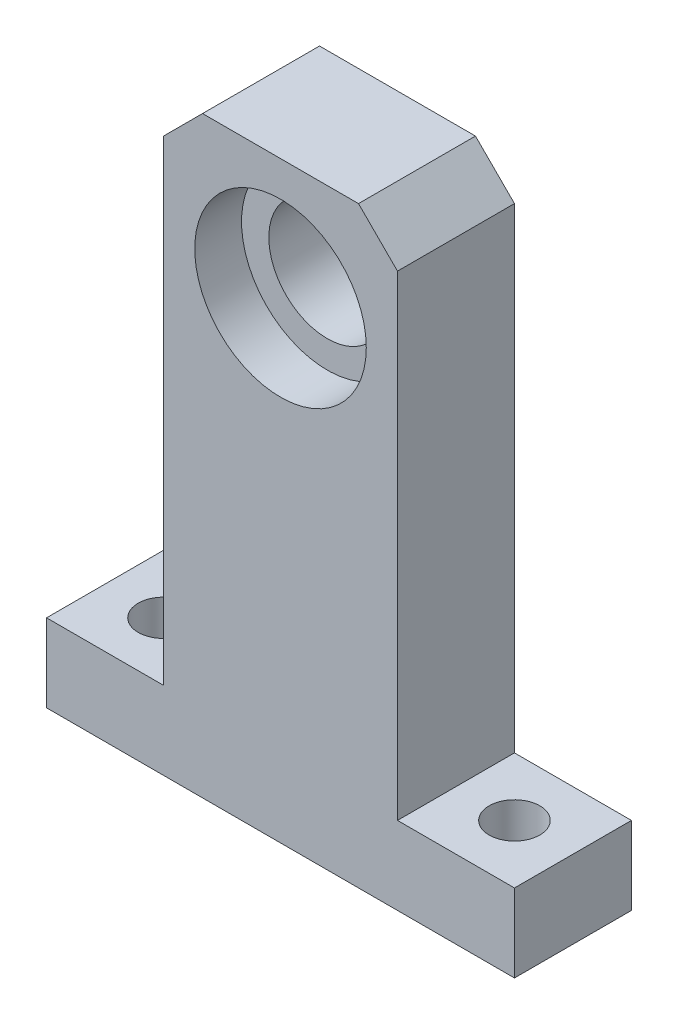
ISO-10303-21;
HEADER;
FILE_DESCRIPTION(('STEP AP214'),'2;1');
FILE_NAME('part.step','',(''),(''),'','','');
FILE_SCHEMA(('AUTOMOTIVE_DESIGN { 1 0 10303 214 1 1 1 1 }'));
ENDSEC;
DATA;
#1=APPLICATION_CONTEXT('core data for automotive mechanical design processes');
#2=APPLICATION_PROTOCOL_DEFINITION('international standard','automotive_design',2000,#1);
#3=PRODUCT_CONTEXT('',#1,'mechanical');
#4=PRODUCT('Part','Part','',(#3));
#5=PRODUCT_RELATED_PRODUCT_CATEGORY('part','',(#4));
#6=PRODUCT_DEFINITION_FORMATION('','',#4);
#7=PRODUCT_DEFINITION_CONTEXT('part definition',#1,'design');
#8=PRODUCT_DEFINITION('design','',#6,#7);
#9=PRODUCT_DEFINITION_SHAPE('','',#8);
#10=(LENGTH_UNIT() NAMED_UNIT(*) SI_UNIT(.MILLI.,.METRE.));
#11=(NAMED_UNIT(*) PLANE_ANGLE_UNIT() SI_UNIT($,.RADIAN.));
#12=(NAMED_UNIT(*) SI_UNIT($,.STERADIAN.) SOLID_ANGLE_UNIT());
#13=UNCERTAINTY_MEASURE_WITH_UNIT(LENGTH_MEASURE(1.E-05),#10,'distance_accuracy_value','');
#14=(GEOMETRIC_REPRESENTATION_CONTEXT(3) GLOBAL_UNCERTAINTY_ASSIGNED_CONTEXT((#13)) GLOBAL_UNIT_ASSIGNED_CONTEXT((#10,
#11,#12)) REPRESENTATION_CONTEXT('',''));
#15=CARTESIAN_POINT('',(0.,0.,0.));
#16=DIRECTION('',(0.,0.,1.));
#17=DIRECTION('',(1.,0.,0.));
#18=AXIS2_PLACEMENT_3D('',#15,#16,#17);
#19=CARTESIAN_POINT('',(0.,22.5,-7.5));
#20=DIRECTION('',(0.,0.,1.));
#21=DIRECTION('',(1.,0.,0.));
#22=AXIS2_PLACEMENT_3D('',#19,#20,#21);
#23=CYLINDRICAL_SURFACE('',#22,7.5);
#24=CARTESIAN_POINT('',(0.,22.5,-7.5));
#25=DIRECTION('',(0.,0.,1.));
#26=DIRECTION('',(1.,0.,0.));
#27=AXIS2_PLACEMENT_3D('',#24,#25,#26);
#28=CIRCLE('',#27,7.5);
#29=CARTESIAN_POINT('',(7.5,22.5,-7.5));
#30=VERTEX_POINT('',#29);
#31=EDGE_CURVE('E420',#30,#30,#28,.T.);
#32=ORIENTED_EDGE('',*,*,#31,.F.);
#33=EDGE_LOOP('',(#32));
#34=FACE_BOUND('',#33,.T.);
#35=CARTESIAN_POINT('',(0.,22.5,1.5));
#36=DIRECTION('',(0.,0.,1.));
#37=DIRECTION('',(1.,0.,0.));
#38=AXIS2_PLACEMENT_3D('',#35,#36,#37);
#39=CIRCLE('',#38,7.5);
#40=CARTESIAN_POINT('',(7.5,22.5,1.5));
#41=VERTEX_POINT('',#40);
#42=EDGE_CURVE('E38',#41,#41,#39,.F.);
#43=ORIENTED_EDGE('',*,*,#42,.F.);
#44=EDGE_LOOP('',(#43));
#45=FACE_BOUND('',#44,.T.);
#46=ADVANCED_FACE('F34',(#34,#45),#23,.F.);
#47=CARTESIAN_POINT('',(30.,38.,7.5));
#48=DIRECTION('',(-1.,0.,0.));
#49=DIRECTION('',(0.,-1.,0.));
#50=AXIS2_PLACEMENT_3D('',#47,#48,#49);
#51=PLANE('',#50);
#52=DIRECTION('',(0.,1.,0.));
#53=VECTOR('',#52,1.);
#54=CARTESIAN_POINT('',(30.,38.,-7.5));
#55=LINE('',#54,#53);
#56=CARTESIAN_POINT('',(30.,-38.,-7.5));
#57=VERTEX_POINT('',#56);
#58=CARTESIAN_POINT('',(30.,-28.,-7.5));
#59=VERTEX_POINT('',#58);
#60=EDGE_CURVE('E131',#57,#59,#55,.T.);
#61=ORIENTED_EDGE('',*,*,#60,.T.);
#62=DIRECTION('',(0.,0.,1.));
#63=VECTOR('',#62,1.);
#64=CARTESIAN_POINT('',(30.,-28.,-7.5));
#65=LINE('',#64,#63);
#66=CARTESIAN_POINT('',(30.,-28.,7.5));
#67=VERTEX_POINT('',#66);
#68=EDGE_CURVE('E113',#59,#67,#65,.T.);
#69=ORIENTED_EDGE('',*,*,#68,.T.);
#70=DIRECTION('',(0.,1.,0.));
#71=VECTOR('',#70,1.);
#72=CARTESIAN_POINT('',(30.,38.,7.5));
#73=LINE('',#72,#71);
#74=CARTESIAN_POINT('',(30.,-38.,7.5));
#75=VERTEX_POINT('',#74);
#76=EDGE_CURVE('E153',#75,#67,#73,.T.);
#77=ORIENTED_EDGE('',*,*,#76,.F.);
#78=DIRECTION('',(0.,0.,-1.));
#79=VECTOR('',#78,1.);
#80=CARTESIAN_POINT('',(30.,-38.,7.5));
#81=LINE('',#80,#79);
#82=EDGE_CURVE('E138',#75,#57,#81,.T.);
#83=ORIENTED_EDGE('',*,*,#82,.T.);
#84=EDGE_LOOP('',(#61,#69,#77,#83));
#85=FACE_BOUND('',#84,.T.);
#86=ADVANCED_FACE('F136',(#85),#51,.F.);
#87=CARTESIAN_POINT('',(-30.,38.,7.5));
#88=DIRECTION('',(0.,-1.,0.));
#89=DIRECTION('',(0.,0.,-1.));
#90=AXIS2_PLACEMENT_3D('',#87,#88,#89);
#91=PLANE('',#90);
#92=DIRECTION('',(-1.,0.,0.));
#93=VECTOR('',#92,1.);
#94=CARTESIAN_POINT('',(-30.,38.,7.5));
#95=LINE('',#94,#93);
#96=CARTESIAN_POINT('',(9.99999999999996,38.,7.5));
#97=VERTEX_POINT('',#96);
#98=CARTESIAN_POINT('',(-10.,38.,7.5));
#99=VERTEX_POINT('',#98);
#100=EDGE_CURVE('E202',#97,#99,#95,.T.);
#101=ORIENTED_EDGE('',*,*,#100,.F.);
#102=DIRECTION('',(0.,0.,-1.));
#103=VECTOR('',#102,1.);
#104=CARTESIAN_POINT('',(9.99999999999996,38.,7.5));
#105=LINE('',#104,#103);
#106=CARTESIAN_POINT('',(9.99999999999997,38.,-7.5));
#107=VERTEX_POINT('',#106);
#108=EDGE_CURVE('E168',#97,#107,#105,.T.);
#109=ORIENTED_EDGE('',*,*,#108,.T.);
#110=DIRECTION('',(-1.,0.,0.));
#111=VECTOR('',#110,1.);
#112=CARTESIAN_POINT('',(-30.,38.,-7.5));
#113=LINE('',#112,#111);
#114=CARTESIAN_POINT('',(-10.,38.,-7.5));
#115=VERTEX_POINT('',#114);
#116=EDGE_CURVE('E139',#107,#115,#113,.T.);
#117=ORIENTED_EDGE('',*,*,#116,.T.);
#118=DIRECTION('',(0.,0.,1.));
#119=VECTOR('',#118,1.);
#120=CARTESIAN_POINT('',(-10.,38.,7.5));
#121=LINE('',#120,#119);
#122=EDGE_CURVE('E165',#115,#99,#121,.T.);
#123=ORIENTED_EDGE('',*,*,#122,.T.);
#124=EDGE_LOOP('',(#101,#109,#117,#123));
#125=FACE_BOUND('',#124,.T.);
#126=ADVANCED_FACE('F227',(#125),#91,.F.);
#127=CARTESIAN_POINT('',(-30.,38.,7.5));
#128=DIRECTION('',(1.,0.,0.));
#129=DIRECTION('',(0.,1.,0.));
#130=AXIS2_PLACEMENT_3D('',#127,#128,#129);
#131=PLANE('',#130);
#132=DIRECTION('',(0.,-1.,0.));
#133=VECTOR('',#132,1.);
#134=CARTESIAN_POINT('',(-30.,38.,7.5));
#135=LINE('',#134,#133);
#136=CARTESIAN_POINT('',(-30.,-28.,7.5));
#137=VERTEX_POINT('',#136);
#138=CARTESIAN_POINT('',(-30.,-38.,7.5));
#139=VERTEX_POINT('',#138);
#140=EDGE_CURVE('E204',#137,#139,#135,.T.);
#141=ORIENTED_EDGE('',*,*,#140,.F.);
#142=DIRECTION('',(0.,0.,1.));
#143=VECTOR('',#142,1.);
#144=CARTESIAN_POINT('',(-30.,-28.,-7.5));
#145=LINE('',#144,#143);
#146=CARTESIAN_POINT('',(-30.,-28.,-7.5));
#147=VERTEX_POINT('',#146);
#148=EDGE_CURVE('E144',#147,#137,#145,.T.);
#149=ORIENTED_EDGE('',*,*,#148,.F.);
#150=DIRECTION('',(0.,-1.,0.));
#151=VECTOR('',#150,1.);
#152=CARTESIAN_POINT('',(-30.,38.,-7.5));
#153=LINE('',#152,#151);
#154=CARTESIAN_POINT('',(-30.,-38.,-7.5));
#155=VERTEX_POINT('',#154);
#156=EDGE_CURVE('E142',#147,#155,#153,.T.);
#157=ORIENTED_EDGE('',*,*,#156,.T.);
#158=DIRECTION('',(0.,0.,-1.));
#159=VECTOR('',#158,1.);
#160=CARTESIAN_POINT('',(-30.,-38.,7.5));
#161=LINE('',#160,#159);
#162=EDGE_CURVE('E155',#139,#155,#161,.T.);
#163=ORIENTED_EDGE('',*,*,#162,.F.);
#164=EDGE_LOOP('',(#141,#149,#157,#163));
#165=FACE_BOUND('',#164,.T.);
#166=ADVANCED_FACE('F217',(#165),#131,.F.);
#167=CARTESIAN_POINT('',(-30.,-38.,7.5));
#168=DIRECTION('',(0.,1.,0.));
#169=DIRECTION('',(0.,0.,1.));
#170=AXIS2_PLACEMENT_3D('',#167,#168,#169);
#171=PLANE('',#170);
#172=CARTESIAN_POINT('',(-22.5,-38.,0.));
#173=DIRECTION('',(0.,-1.,0.));
#174=DIRECTION('',(0.,0.,-1.));
#175=AXIS2_PLACEMENT_3D('',#172,#173,#174);
#176=CIRCLE('',#175,3.25);
#177=CARTESIAN_POINT('',(-22.5,-38.,-3.25));
#178=VERTEX_POINT('',#177);
#179=EDGE_CURVE('E184',#178,#178,#176,.T.);
#180=ORIENTED_EDGE('',*,*,#179,.F.);
#181=EDGE_LOOP('',(#180));
#182=FACE_BOUND('',#181,.T.);
#183=CARTESIAN_POINT('',(22.5,-38.,0.));
#184=DIRECTION('',(0.,-1.,0.));
#185=DIRECTION('',(0.,0.,-1.));
#186=AXIS2_PLACEMENT_3D('',#183,#184,#185);
#187=CIRCLE('',#186,3.25);
#188=CARTESIAN_POINT('',(22.5,-38.,-3.25));
#189=VERTEX_POINT('',#188);
#190=EDGE_CURVE('E174',#189,#189,#187,.T.);
#191=ORIENTED_EDGE('',*,*,#190,.F.);
#192=EDGE_LOOP('',(#191));
#193=FACE_BOUND('',#192,.T.);
#194=DIRECTION('',(1.,0.,0.));
#195=VECTOR('',#194,1.);
#196=CARTESIAN_POINT('',(-30.,-38.,-7.5));
#197=LINE('',#196,#195);
#198=EDGE_CURVE('E151',#155,#57,#197,.T.);
#199=ORIENTED_EDGE('',*,*,#198,.T.);
#200=ORIENTED_EDGE('',*,*,#82,.F.);
#201=DIRECTION('',(1.,0.,0.));
#202=VECTOR('',#201,1.);
#203=CARTESIAN_POINT('',(-30.,-38.,7.5));
#204=LINE('',#203,#202);
#205=EDGE_CURVE('E147',#139,#75,#204,.T.);
#206=ORIENTED_EDGE('',*,*,#205,.F.);
#207=ORIENTED_EDGE('',*,*,#162,.T.);
#208=EDGE_LOOP('',(#199,#200,#206,#207));
#209=FACE_BOUND('',#208,.T.);
#210=ADVANCED_FACE('F213',(#182,#193,#209),#171,.F.);
#211=CARTESIAN_POINT('',(30.,-38.,7.5));
#212=DIRECTION('',(0.,0.,1.));
#213=DIRECTION('',(1.,0.,0.));
#214=AXIS2_PLACEMENT_3D('',#211,#212,#213);
#215=PLANE('',#214);
#216=CARTESIAN_POINT('',(0.,22.5,7.5));
#217=DIRECTION('',(0.,0.,1.));
#218=DIRECTION('',(1.,0.,0.));
#219=AXIS2_PLACEMENT_3D('',#216,#217,#218);
#220=CIRCLE('',#219,11.);
#221=CARTESIAN_POINT('',(11.,22.5,7.5));
#222=VERTEX_POINT('',#221);
#223=EDGE_CURVE('E416',#222,#222,#220,.T.);
#224=ORIENTED_EDGE('',*,*,#223,.F.);
#225=EDGE_LOOP('',(#224));
#226=FACE_BOUND('',#225,.T.);
#227=DIRECTION('',(0.,-1.,0.));
#228=VECTOR('',#227,1.);
#229=CARTESIAN_POINT('',(15.,38.,7.5));
#230=LINE('',#229,#228);
#231=CARTESIAN_POINT('',(15.,33.,7.5));
#232=VERTEX_POINT('',#231);
#233=CARTESIAN_POINT('',(15.,-28.,7.5));
#234=VERTEX_POINT('',#233);
#235=EDGE_CURVE('E173',#232,#234,#230,.T.);
#236=ORIENTED_EDGE('',*,*,#235,.F.);
#237=DIRECTION('',(0.707106781186549,-0.707106781186546,0.));
#238=VECTOR('',#237,1.);
#239=CARTESIAN_POINT('',(58.,-9.99999999999982,7.5));
#240=LINE('',#239,#238);
#241=EDGE_CURVE('E163',#232,#97,#240,.F.);
#242=ORIENTED_EDGE('',*,*,#241,.T.);
#243=ORIENTED_EDGE('',*,*,#100,.T.);
#244=DIRECTION('',(0.707106781186546,0.707106781186549,0.));
#245=VECTOR('',#244,1.);
#246=CARTESIAN_POINT('',(-28.0000000000001,19.9999999999998,7.5));
#247=LINE('',#246,#245);
#248=CARTESIAN_POINT('',(-15.,33.,7.5));
#249=VERTEX_POINT('',#248);
#250=EDGE_CURVE('E161',#99,#249,#247,.F.);
#251=ORIENTED_EDGE('',*,*,#250,.T.);
#252=DIRECTION('',(0.,1.,0.));
#253=VECTOR('',#252,1.);
#254=CARTESIAN_POINT('',(-15.,38.,7.5));
#255=LINE('',#254,#253);
#256=CARTESIAN_POINT('',(-15.,-28.,7.5));
#257=VERTEX_POINT('',#256);
#258=EDGE_CURVE('E195',#257,#249,#255,.T.);
#259=ORIENTED_EDGE('',*,*,#258,.F.);
#260=DIRECTION('',(1.,0.,0.));
#261=VECTOR('',#260,1.);
#262=CARTESIAN_POINT('',(-30.,-28.,7.5));
#263=LINE('',#262,#261);
#264=EDGE_CURVE('E125',#137,#257,#263,.T.);
#265=ORIENTED_EDGE('',*,*,#264,.F.);
#266=ORIENTED_EDGE('',*,*,#140,.T.);
#267=ORIENTED_EDGE('',*,*,#205,.T.);
#268=ORIENTED_EDGE('',*,*,#76,.T.);
#269=DIRECTION('',(1.,0.,0.));
#270=VECTOR('',#269,1.);
#271=CARTESIAN_POINT('',(30.,-28.,7.5));
#272=LINE('',#271,#270);
#273=EDGE_CURVE('E120',#234,#67,#272,.T.);
#274=ORIENTED_EDGE('',*,*,#273,.F.);
#275=EDGE_LOOP('',(#236,#242,#243,#251,#259,#265,#266,#267,#268,#274));
#276=FACE_BOUND('',#275,.T.);
#277=ADVANCED_FACE('F211',(#226,#276),#215,.T.);
#278=CARTESIAN_POINT('',(30.,-38.,-7.5));
#279=DIRECTION('',(0.,0.,1.));
#280=DIRECTION('',(1.,0.,0.));
#281=AXIS2_PLACEMENT_3D('',#278,#279,#280);
#282=PLANE('',#281);
#283=ORIENTED_EDGE('',*,*,#31,.T.);
#284=EDGE_LOOP('',(#283));
#285=FACE_BOUND('',#284,.T.);
#286=ORIENTED_EDGE('',*,*,#116,.F.);
#287=DIRECTION('',(-0.707106781186549,0.707106781186546,0.));
#288=VECTOR('',#287,1.);
#289=CARTESIAN_POINT('',(15.,33.,-7.5));
#290=LINE('',#289,#288);
#291=CARTESIAN_POINT('',(15.,33.,-7.5));
#292=VERTEX_POINT('',#291);
#293=EDGE_CURVE('E43',#107,#292,#290,.F.);
#294=ORIENTED_EDGE('',*,*,#293,.T.);
#295=DIRECTION('',(0.,-1.,0.));
#296=VECTOR('',#295,1.);
#297=CARTESIAN_POINT('',(15.,38.,-7.5));
#298=LINE('',#297,#296);
#299=CARTESIAN_POINT('',(15.,-28.,-7.5));
#300=VERTEX_POINT('',#299);
#301=EDGE_CURVE('E133',#292,#300,#298,.T.);
#302=ORIENTED_EDGE('',*,*,#301,.T.);
#303=DIRECTION('',(1.,0.,0.));
#304=VECTOR('',#303,1.);
#305=CARTESIAN_POINT('',(30.,-28.,-7.5));
#306=LINE('',#305,#304);
#307=EDGE_CURVE('E117',#300,#59,#306,.T.);
#308=ORIENTED_EDGE('',*,*,#307,.T.);
#309=ORIENTED_EDGE('',*,*,#60,.F.);
#310=ORIENTED_EDGE('',*,*,#198,.F.);
#311=ORIENTED_EDGE('',*,*,#156,.F.);
#312=DIRECTION('',(1.,0.,0.));
#313=VECTOR('',#312,1.);
#314=CARTESIAN_POINT('',(-30.,-28.,-7.5));
#315=LINE('',#314,#313);
#316=CARTESIAN_POINT('',(-15.,-28.,-7.5));
#317=VERTEX_POINT('',#316);
#318=EDGE_CURVE('E191',#147,#317,#315,.T.);
#319=ORIENTED_EDGE('',*,*,#318,.T.);
#320=DIRECTION('',(0.,1.,0.));
#321=VECTOR('',#320,1.);
#322=CARTESIAN_POINT('',(-15.,38.,-7.5));
#323=LINE('',#322,#321);
#324=CARTESIAN_POINT('',(-15.,33.,-7.5));
#325=VERTEX_POINT('',#324);
#326=EDGE_CURVE('E194',#317,#325,#323,.T.);
#327=ORIENTED_EDGE('',*,*,#326,.T.);
#328=DIRECTION('',(-0.707106781186546,-0.707106781186549,0.));
#329=VECTOR('',#328,1.);
#330=CARTESIAN_POINT('',(-10.,38.,-7.5));
#331=LINE('',#330,#329);
#332=EDGE_CURVE('E56',#325,#115,#331,.F.);
#333=ORIENTED_EDGE('',*,*,#332,.T.);
#334=EDGE_LOOP('',(#286,#294,#302,#308,#309,#310,#311,#319,#327,#333));
#335=FACE_BOUND('',#334,.T.);
#336=ADVANCED_FACE('F129',(#285,#335),#282,.F.);
#337=CARTESIAN_POINT('',(-15.,38.,-7.5));
#338=DIRECTION('',(1.,0.,0.));
#339=DIRECTION('',(0.,1.,0.));
#340=AXIS2_PLACEMENT_3D('',#337,#338,#339);
#341=PLANE('',#340);
#342=ORIENTED_EDGE('',*,*,#258,.T.);
#343=DIRECTION('',(0.,0.,-1.));
#344=VECTOR('',#343,1.);
#345=CARTESIAN_POINT('',(-15.,33.,-7.5));
#346=LINE('',#345,#344);
#347=EDGE_CURVE('E11',#249,#325,#346,.T.);
#348=ORIENTED_EDGE('',*,*,#347,.T.);
#349=ORIENTED_EDGE('',*,*,#326,.F.);
#350=DIRECTION('',(0.,0.,1.));
#351=VECTOR('',#350,1.);
#352=CARTESIAN_POINT('',(-15.,-28.,-7.5));
#353=LINE('',#352,#351);
#354=EDGE_CURVE('E140',#317,#257,#353,.T.);
#355=ORIENTED_EDGE('',*,*,#354,.T.);
#356=EDGE_LOOP('',(#342,#348,#349,#355));
#357=FACE_BOUND('',#356,.T.);
#358=ADVANCED_FACE('F222',(#357),#341,.F.);
#359=CARTESIAN_POINT('',(-30.,-28.,-7.5));
#360=DIRECTION('',(0.,-1.,0.));
#361=DIRECTION('',(1.,0.,0.));
#362=AXIS2_PLACEMENT_3D('',#359,#360,#361);
#363=PLANE('',#362);
#364=CARTESIAN_POINT('',(-22.5,-28.,0.));
#365=DIRECTION('',(0.,-1.,0.));
#366=DIRECTION('',(1.,0.,0.));
#367=AXIS2_PLACEMENT_3D('',#364,#365,#366);
#368=CIRCLE('',#367,3.25);
#369=CARTESIAN_POINT('',(-19.25,-28.,0.));
#370=VERTEX_POINT('',#369);
#371=EDGE_CURVE('E179',#370,#370,#368,.T.);
#372=ORIENTED_EDGE('',*,*,#371,.T.);
#373=EDGE_LOOP('',(#372));
#374=FACE_BOUND('',#373,.T.);
#375=ORIENTED_EDGE('',*,*,#264,.T.);
#376=ORIENTED_EDGE('',*,*,#354,.F.);
#377=ORIENTED_EDGE('',*,*,#318,.F.);
#378=ORIENTED_EDGE('',*,*,#148,.T.);
#379=EDGE_LOOP('',(#375,#376,#377,#378));
#380=FACE_BOUND('',#379,.T.);
#381=ADVANCED_FACE('F219',(#374,#380),#363,.F.);
#382=CARTESIAN_POINT('',(30.,-28.,-7.5));
#383=DIRECTION('',(0.,-1.,0.));
#384=DIRECTION('',(1.,0.,0.));
#385=AXIS2_PLACEMENT_3D('',#382,#383,#384);
#386=PLANE('',#385);
#387=CARTESIAN_POINT('',(22.5,-28.,0.));
#388=DIRECTION('',(0.,-1.,0.));
#389=DIRECTION('',(1.,0.,0.));
#390=AXIS2_PLACEMENT_3D('',#387,#388,#389);
#391=CIRCLE('',#390,3.25);
#392=CARTESIAN_POINT('',(25.75,-28.,0.));
#393=VERTEX_POINT('',#392);
#394=EDGE_CURVE('E171',#393,#393,#391,.T.);
#395=ORIENTED_EDGE('',*,*,#394,.T.);
#396=EDGE_LOOP('',(#395));
#397=FACE_BOUND('',#396,.T.);
#398=ORIENTED_EDGE('',*,*,#273,.T.);
#399=ORIENTED_EDGE('',*,*,#68,.F.);
#400=ORIENTED_EDGE('',*,*,#307,.F.);
#401=DIRECTION('',(0.,0.,1.));
#402=VECTOR('',#401,1.);
#403=CARTESIAN_POINT('',(15.,-28.,-7.5));
#404=LINE('',#403,#402);
#405=EDGE_CURVE('E126',#300,#234,#404,.T.);
#406=ORIENTED_EDGE('',*,*,#405,.T.);
#407=EDGE_LOOP('',(#398,#399,#400,#406));
#408=FACE_BOUND('',#407,.T.);
#409=ADVANCED_FACE('F115',(#397,#408),#386,.F.);
#410=CARTESIAN_POINT('',(15.,38.,-7.5));
#411=DIRECTION('',(-1.,0.,0.));
#412=DIRECTION('',(0.,-1.,0.));
#413=AXIS2_PLACEMENT_3D('',#410,#411,#412);
#414=PLANE('',#413);
#415=ORIENTED_EDGE('',*,*,#301,.F.);
#416=DIRECTION('',(0.,0.,1.));
#417=VECTOR('',#416,1.);
#418=CARTESIAN_POINT('',(15.,33.,-7.5));
#419=LINE('',#418,#417);
#420=EDGE_CURVE('E158',#292,#232,#419,.T.);
#421=ORIENTED_EDGE('',*,*,#420,.T.);
#422=ORIENTED_EDGE('',*,*,#235,.T.);
#423=ORIENTED_EDGE('',*,*,#405,.F.);
#424=EDGE_LOOP('',(#415,#421,#422,#423));
#425=FACE_BOUND('',#424,.T.);
#426=ADVANCED_FACE('F234',(#425),#414,.F.);
#427=CARTESIAN_POINT('',(15.,33.,-7.5));
#428=DIRECTION('',(-0.707106781186546,-0.707106781186549,0.));
#429=DIRECTION('',(0.707106781186549,-0.707106781186546,0.));
#430=AXIS2_PLACEMENT_3D('',#427,#428,#429);
#431=PLANE('',#430);
#432=ORIENTED_EDGE('',*,*,#293,.F.);
#433=ORIENTED_EDGE('',*,*,#108,.F.);
#434=ORIENTED_EDGE('',*,*,#241,.F.);
#435=ORIENTED_EDGE('',*,*,#420,.F.);
#436=EDGE_LOOP('',(#432,#433,#434,#435));
#437=FACE_BOUND('',#436,.T.);
#438=ADVANCED_FACE('F232',(#437),#431,.F.);
#439=CARTESIAN_POINT('',(-10.,38.,7.5));
#440=DIRECTION('',(0.707106781186549,-0.707106781186546,0.));
#441=DIRECTION('',(0.707106781186546,0.707106781186549,0.));
#442=AXIS2_PLACEMENT_3D('',#439,#440,#441);
#443=PLANE('',#442);
#444=ORIENTED_EDGE('',*,*,#332,.F.);
#445=ORIENTED_EDGE('',*,*,#347,.F.);
#446=ORIENTED_EDGE('',*,*,#250,.F.);
#447=ORIENTED_EDGE('',*,*,#122,.F.);
#448=EDGE_LOOP('',(#444,#445,#446,#447));
#449=FACE_BOUND('',#448,.T.);
#450=ADVANCED_FACE('F36',(#449),#443,.F.);
#451=CARTESIAN_POINT('',(22.5,-38.,0.));
#452=DIRECTION('',(0.,-1.,0.));
#453=DIRECTION('',(0.,0.,-1.));
#454=AXIS2_PLACEMENT_3D('',#451,#452,#453);
#455=CYLINDRICAL_SURFACE('',#454,3.25);
#456=ORIENTED_EDGE('',*,*,#190,.T.);
#457=EDGE_LOOP('',(#456));
#458=FACE_BOUND('',#457,.T.);
#459=ORIENTED_EDGE('',*,*,#394,.F.);
#460=EDGE_LOOP('',(#459));
#461=FACE_BOUND('',#460,.T.);
#462=ADVANCED_FACE('F260',(#458,#461),#455,.F.);
#463=CARTESIAN_POINT('',(-22.5,-38.,0.));
#464=DIRECTION('',(0.,-1.,0.));
#465=DIRECTION('',(0.,0.,-1.));
#466=AXIS2_PLACEMENT_3D('',#463,#464,#465);
#467=CYLINDRICAL_SURFACE('',#466,3.25);
#468=ORIENTED_EDGE('',*,*,#179,.T.);
#469=EDGE_LOOP('',(#468));
#470=FACE_BOUND('',#469,.T.);
#471=ORIENTED_EDGE('',*,*,#371,.F.);
#472=EDGE_LOOP('',(#471));
#473=FACE_BOUND('',#472,.T.);
#474=ADVANCED_FACE('F256',(#470,#473),#467,.F.);
#475=CARTESIAN_POINT('',(0.,22.5,1.5));
#476=DIRECTION('',(0.,0.,1.));
#477=DIRECTION('',(1.,0.,0.));
#478=AXIS2_PLACEMENT_3D('',#475,#476,#477);
#479=PLANE('',#478);
#480=CARTESIAN_POINT('',(0.,22.5,1.5));
#481=DIRECTION('',(0.,0.,1.));
#482=DIRECTION('',(1.,0.,0.));
#483=AXIS2_PLACEMENT_3D('',#480,#481,#482);
#484=CIRCLE('',#483,11.);
#485=CARTESIAN_POINT('',(11.,22.5,1.5));
#486=VERTEX_POINT('',#485);
#487=EDGE_CURVE('E413',#486,#486,#484,.T.);
#488=ORIENTED_EDGE('',*,*,#487,.T.);
#489=EDGE_LOOP('',(#488));
#490=FACE_BOUND('',#489,.T.);
#491=ORIENTED_EDGE('',*,*,#42,.T.);
#492=EDGE_LOOP('',(#491));
#493=FACE_BOUND('',#492,.T.);
#494=ADVANCED_FACE('F259',(#490,#493),#479,.T.);
#495=CARTESIAN_POINT('',(0.,22.5,1.5));
#496=DIRECTION('',(0.,0.,1.));
#497=DIRECTION('',(1.,0.,0.));
#498=AXIS2_PLACEMENT_3D('',#495,#496,#497);
#499=CYLINDRICAL_SURFACE('',#498,11.);
#500=ORIENTED_EDGE('',*,*,#487,.F.);
#501=EDGE_LOOP('',(#500));
#502=FACE_BOUND('',#501,.T.);
#503=ORIENTED_EDGE('',*,*,#223,.T.);
#504=EDGE_LOOP('',(#503));
#505=FACE_BOUND('',#504,.T.);
#506=ADVANCED_FACE('F254',(#502,#505),#499,.F.);
#507=CLOSED_SHELL('',(#46,#86,#126,#166,#210,#277,#336,#358,#381,#409,#426,#438,#450,#462,#474,
#494,#506));
#508=MANIFOLD_SOLID_BREP('B2',#507);
#509=ADVANCED_BREP_SHAPE_REPRESENTATION('',(#18,#508),#14);
#510=SHAPE_DEFINITION_REPRESENTATION(#9,#509);
ENDSEC;
END-ISO-10303-21;
